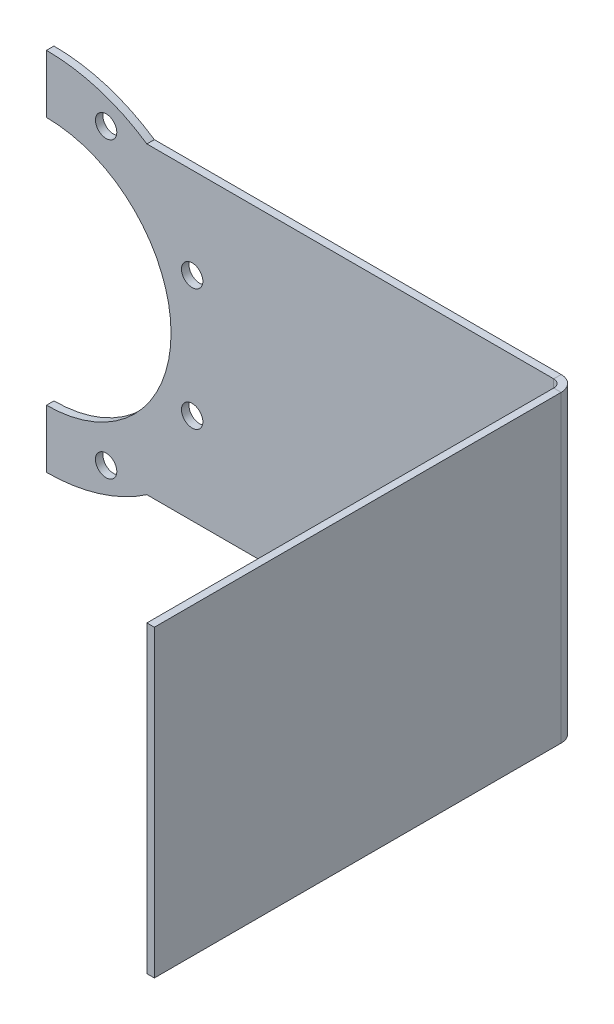
ISO-10303-21;
HEADER;
FILE_DESCRIPTION(('STEP AP214'),'2;1');
FILE_NAME('part.step','',(''),(''),'','','');
FILE_SCHEMA(('AUTOMOTIVE_DESIGN { 1 0 10303 214 1 1 1 1 }'));
ENDSEC;
DATA;
#1=APPLICATION_CONTEXT('core data for automotive mechanical design processes');
#2=APPLICATION_PROTOCOL_DEFINITION('international standard','automotive_design',2000,#1);
#3=PRODUCT_CONTEXT('',#1,'mechanical');
#4=PRODUCT('Part','Part','',(#3));
#5=PRODUCT_RELATED_PRODUCT_CATEGORY('part','',(#4));
#6=PRODUCT_DEFINITION_FORMATION('','',#4);
#7=PRODUCT_DEFINITION_CONTEXT('part definition',#1,'design');
#8=PRODUCT_DEFINITION('design','',#6,#7);
#9=PRODUCT_DEFINITION_SHAPE('','',#8);
#10=(LENGTH_UNIT() NAMED_UNIT(*) SI_UNIT(.MILLI.,.METRE.));
#11=(NAMED_UNIT(*) PLANE_ANGLE_UNIT() SI_UNIT($,.RADIAN.));
#12=(NAMED_UNIT(*) SI_UNIT($,.STERADIAN.) SOLID_ANGLE_UNIT());
#13=UNCERTAINTY_MEASURE_WITH_UNIT(LENGTH_MEASURE(1.E-05),#10,'distance_accuracy_value','');
#14=(GEOMETRIC_REPRESENTATION_CONTEXT(3) GLOBAL_UNCERTAINTY_ASSIGNED_CONTEXT((#13)) GLOBAL_UNIT_ASSIGNED_CONTEXT((#10,
#11,#12)) REPRESENTATION_CONTEXT('',''));
#15=CARTESIAN_POINT('',(0.,0.,0.));
#16=DIRECTION('',(0.,0.,1.));
#17=DIRECTION('',(1.,0.,0.));
#18=AXIS2_PLACEMENT_3D('',#15,#16,#17);
#19=CARTESIAN_POINT('',(108.791351850249,0.813693745948828,-108.811310834662));
#20=DIRECTION('',(1.,0.,0.));
#21=DIRECTION('',(0.,0.,-1.));
#22=AXIS2_PLACEMENT_3D('',#19,#20,#21);
#23=PLANE('',#22);
#24=DIRECTION('',(0.,0.,-1.));
#25=VECTOR('',#24,1.);
#26=CARTESIAN_POINT('',(108.791351850249,31.9980801149858,-87.6516665369411));
#27=LINE('',#26,#25);
#28=CARTESIAN_POINT('',(108.791351850249,31.9980801149857,87.3817075525276));
#29=VERTEX_POINT('',#28);
#30=CARTESIAN_POINT('',(108.791351850249,31.9980801149858,1.67640000000004));
#31=VERTEX_POINT('',#30);
#32=EDGE_CURVE('E64',#29,#31,#27,.T.);
#33=ORIENTED_EDGE('',*,*,#32,.T.);
#34=DIRECTION('',(0.,-1.,0.));
#35=VECTOR('',#34,1.);
#36=CARTESIAN_POINT('',(108.791351850249,0.813693745948828,1.67640000000002));
#37=LINE('',#36,#35);
#38=CARTESIAN_POINT('',(108.791351850249,-31.9980801149858,1.67640000000004));
#39=VERTEX_POINT('',#38);
#40=EDGE_CURVE('E56',#31,#39,#37,.T.);
#41=ORIENTED_EDGE('',*,*,#40,.T.);
#42=DIRECTION('',(0.,0.,1.));
#43=VECTOR('',#42,1.);
#44=CARTESIAN_POINT('',(108.791351850249,-31.9980801149858,87.3817075525276));
#45=LINE('',#44,#43);
#46=CARTESIAN_POINT('',(108.791351850249,-31.9980801149858,87.3817075525276));
#47=VERTEX_POINT('',#46);
#48=EDGE_CURVE('E72',#39,#47,#45,.T.);
#49=ORIENTED_EDGE('',*,*,#48,.T.);
#50=DIRECTION('',(0.,1.,0.));
#51=VECTOR('',#50,1.);
#52=CARTESIAN_POINT('',(108.791351850249,31.9980801149857,87.3817075525276));
#53=LINE('',#52,#51);
#54=EDGE_CURVE('E230',#47,#29,#53,.T.);
#55=ORIENTED_EDGE('',*,*,#54,.T.);
#56=EDGE_LOOP('',(#33,#41,#49,#55));
#57=FACE_BOUND('',#56,.T.);
#58=ADVANCED_FACE('F47',(#57),#23,.F.);
#59=CARTESIAN_POINT('',(110.366151850249,31.9980801149858,-87.6516665369411));
#60=DIRECTION('',(0.,1.,0.));
#61=DIRECTION('',(-1.,0.,0.));
#62=AXIS2_PLACEMENT_3D('',#59,#60,#61);
#63=PLANE('',#62);
#64=DIRECTION('',(1.,0.,0.));
#65=VECTOR('',#64,1.);
#66=CARTESIAN_POINT('',(110.366151850249,31.9980801149858,1.67640000000002));
#67=LINE('',#66,#65);
#68=CARTESIAN_POINT('',(110.366151850249,31.9980801149858,1.67640000000004));
#69=VERTEX_POINT('',#68);
#70=EDGE_CURVE('E12',#31,#69,#67,.T.);
#71=ORIENTED_EDGE('',*,*,#70,.F.);
#72=ORIENTED_EDGE('',*,*,#32,.F.);
#73=DIRECTION('',(-1.,0.,0.));
#74=VECTOR('',#73,1.);
#75=CARTESIAN_POINT('',(110.366151850249,31.9980801149857,87.3817075525276));
#76=LINE('',#75,#74);
#77=CARTESIAN_POINT('',(110.366151850249,31.9980801149857,87.3817075525276));
#78=VERTEX_POINT('',#77);
#79=EDGE_CURVE('E232',#78,#29,#76,.T.);
#80=ORIENTED_EDGE('',*,*,#79,.F.);
#81=DIRECTION('',(0.,0.,-1.));
#82=VECTOR('',#81,1.);
#83=CARTESIAN_POINT('',(110.366151850249,31.9980801149858,-6.1316308956318));
#84=LINE('',#83,#82);
#85=EDGE_CURVE('E229',#78,#69,#84,.T.);
#86=ORIENTED_EDGE('',*,*,#85,.T.);
#87=EDGE_LOOP('',(#71,#72,#80,#86));
#88=FACE_BOUND('',#87,.T.);
#89=ADVANCED_FACE('F49',(#88),#63,.T.);
#90=CARTESIAN_POINT('',(110.366151850249,31.9980801149857,87.3817075525276));
#91=DIRECTION('',(0.,0.,1.));
#92=DIRECTION('',(0.,1.,0.));
#93=AXIS2_PLACEMENT_3D('',#90,#91,#92);
#94=PLANE('',#93);
#95=ORIENTED_EDGE('',*,*,#54,.F.);
#96=DIRECTION('',(-1.,0.,0.));
#97=VECTOR('',#96,1.);
#98=CARTESIAN_POINT('',(110.366151850249,-31.9980801149858,87.3817075525276));
#99=LINE('',#98,#97);
#100=CARTESIAN_POINT('',(110.366151850249,-31.9980801149858,87.3817075525276));
#101=VERTEX_POINT('',#100);
#102=EDGE_CURVE('E235',#101,#47,#99,.T.);
#103=ORIENTED_EDGE('',*,*,#102,.F.);
#104=DIRECTION('',(0.,1.,0.));
#105=VECTOR('',#104,1.);
#106=CARTESIAN_POINT('',(110.366151850249,31.9980801149857,87.3817075525276));
#107=LINE('',#106,#105);
#108=EDGE_CURVE('E226',#101,#78,#107,.T.);
#109=ORIENTED_EDGE('',*,*,#108,.T.);
#110=ORIENTED_EDGE('',*,*,#79,.T.);
#111=EDGE_LOOP('',(#95,#103,#109,#110));
#112=FACE_BOUND('',#111,.T.);
#113=ADVANCED_FACE('F251',(#112),#94,.T.);
#114=CARTESIAN_POINT('',(110.366151850249,-31.9980801149858,87.3817075525276));
#115=DIRECTION('',(0.,-1.,0.));
#116=DIRECTION('',(1.,0.,0.));
#117=AXIS2_PLACEMENT_3D('',#114,#115,#116);
#118=PLANE('',#117);
#119=DIRECTION('',(-1.,0.,0.));
#120=VECTOR('',#119,1.);
#121=CARTESIAN_POINT('',(110.366151850249,-31.9980801149858,1.67640000000004));
#122=LINE('',#121,#120);
#123=CARTESIAN_POINT('',(110.366151850249,-31.9980801149858,1.67639999999997));
#124=VERTEX_POINT('',#123);
#125=EDGE_CURVE('E238',#124,#39,#122,.T.);
#126=ORIENTED_EDGE('',*,*,#125,.F.);
#127=DIRECTION('',(0.,0.,1.));
#128=VECTOR('',#127,1.);
#129=CARTESIAN_POINT('',(110.366151850249,-31.9980801149857,-6.13163089563183));
#130=LINE('',#129,#128);
#131=EDGE_CURVE('E51',#124,#101,#130,.T.);
#132=ORIENTED_EDGE('',*,*,#131,.T.);
#133=ORIENTED_EDGE('',*,*,#102,.T.);
#134=ORIENTED_EDGE('',*,*,#48,.F.);
#135=EDGE_LOOP('',(#126,#132,#133,#134));
#136=FACE_BOUND('',#135,.T.);
#137=ADVANCED_FACE('F246',(#136),#118,.T.);
#138=CARTESIAN_POINT('',(110.366151850249,0.813693745948828,-108.811310834662));
#139=DIRECTION('',(1.,0.,0.));
#140=DIRECTION('',(0.,0.,-1.));
#141=AXIS2_PLACEMENT_3D('',#138,#139,#140);
#142=PLANE('',#141);
#143=DIRECTION('',(0.,-1.,0.));
#144=VECTOR('',#143,1.);
#145=CARTESIAN_POINT('',(110.366151850249,0.813693745948828,1.67640000000002));
#146=LINE('',#145,#144);
#147=EDGE_CURVE('E158',#69,#124,#146,.T.);
#148=ORIENTED_EDGE('',*,*,#147,.F.);
#149=ORIENTED_EDGE('',*,*,#85,.F.);
#150=ORIENTED_EDGE('',*,*,#108,.F.);
#151=ORIENTED_EDGE('',*,*,#131,.F.);
#152=EDGE_LOOP('',(#148,#149,#150,#151));
#153=FACE_BOUND('',#152,.T.);
#154=ADVANCED_FACE('F253',(#153),#142,.T.);
#155=CARTESIAN_POINT('',(0.250000000000011,0.813693745948779,-1.5748));
#156=DIRECTION('',(0.,0.,1.));
#157=DIRECTION('',(1.,0.,0.));
#158=AXIS2_PLACEMENT_3D('',#155,#156,#157);
#159=CYLINDRICAL_SURFACE('',#158,37.685494557183);
#160=CARTESIAN_POINT('',(0.250000000000011,0.813693745948779,0.));
#161=DIRECTION('',(0.,0.,1.));
#162=DIRECTION('',(-1.,0.,0.));
#163=AXIS2_PLACEMENT_3D('',#160,#161,#162);
#164=CIRCLE('',#163,37.685494557183);
#165=CARTESIAN_POINT('',(21.4096442977214,31.9980801149858,0.));
#166=VERTEX_POINT('',#165);
#167=CARTESIAN_POINT('',(0.25,38.4991883031318,0.));
#168=VERTEX_POINT('',#167);
#169=EDGE_CURVE('E285',#166,#168,#164,.T.);
#170=ORIENTED_EDGE('',*,*,#169,.F.);
#171=DIRECTION('',(0.,0.,1.));
#172=VECTOR('',#171,1.);
#173=CARTESIAN_POINT('',(21.4096442977214,31.9980801149858,-1.5748));
#174=LINE('',#173,#172);
#175=CARTESIAN_POINT('',(21.4096442977214,31.9980801149858,-1.5748));
#176=VERTEX_POINT('',#175);
#177=EDGE_CURVE('E243',#176,#166,#174,.T.);
#178=ORIENTED_EDGE('',*,*,#177,.F.);
#179=CARTESIAN_POINT('',(0.250000000000011,0.813693745948779,-1.5748));
#180=DIRECTION('',(0.,0.,1.));
#181=DIRECTION('',(-1.,0.,0.));
#182=AXIS2_PLACEMENT_3D('',#179,#180,#181);
#183=CIRCLE('',#182,37.685494557183);
#184=CARTESIAN_POINT('',(0.25,38.4991883031318,-1.5748));
#185=VERTEX_POINT('',#184);
#186=EDGE_CURVE('E222',#176,#185,#183,.T.);
#187=ORIENTED_EDGE('',*,*,#186,.T.);
#188=DIRECTION('',(0.,0.,1.));
#189=VECTOR('',#188,1.);
#190=CARTESIAN_POINT('',(0.25,38.4991883031318,-1.5748));
#191=LINE('',#190,#189);
#192=EDGE_CURVE('E220',#185,#168,#191,.T.);
#193=ORIENTED_EDGE('',*,*,#192,.T.);
#194=EDGE_LOOP('',(#170,#178,#187,#193));
#195=FACE_BOUND('',#194,.T.);
#196=ADVANCED_FACE('F297',(#195),#159,.T.);
#197=CARTESIAN_POINT('',(0.25,38.4991883031318,-1.5748));
#198=DIRECTION('',(-1.,0.,0.));
#199=DIRECTION('',(0.,-1.,0.));
#200=AXIS2_PLACEMENT_3D('',#197,#198,#199);
#201=PLANE('',#200);
#202=DIRECTION('',(0.,-1.,0.));
#203=VECTOR('',#202,1.);
#204=CARTESIAN_POINT('',(0.25,38.4991883031318,0.));
#205=LINE('',#204,#203);
#206=CARTESIAN_POINT('',(0.250000000000009,26.2488094968134,0.));
#207=VERTEX_POINT('',#206);
#208=EDGE_CURVE('E282',#168,#207,#205,.T.);
#209=ORIENTED_EDGE('',*,*,#208,.F.);
#210=ORIENTED_EDGE('',*,*,#192,.F.);
#211=DIRECTION('',(0.,-1.,0.));
#212=VECTOR('',#211,1.);
#213=CARTESIAN_POINT('',(0.25,38.4991883031318,-1.5748));
#214=LINE('',#213,#212);
#215=CARTESIAN_POINT('',(0.250000000000009,26.2488094968134,-1.5748));
#216=VERTEX_POINT('',#215);
#217=EDGE_CURVE('E217',#185,#216,#214,.T.);
#218=ORIENTED_EDGE('',*,*,#217,.T.);
#219=DIRECTION('',(0.,0.,1.));
#220=VECTOR('',#219,1.);
#221=CARTESIAN_POINT('',(0.250000000000009,26.2488094968134,-1.5748));
#222=LINE('',#221,#220);
#223=EDGE_CURVE('E215',#216,#207,#222,.T.);
#224=ORIENTED_EDGE('',*,*,#223,.T.);
#225=EDGE_LOOP('',(#209,#210,#218,#224));
#226=FACE_BOUND('',#225,.T.);
#227=ADVANCED_FACE('F301',(#226),#201,.T.);
#228=CARTESIAN_POINT('',(0.250000000000007,0.,-1.5748));
#229=DIRECTION('',(0.,0.,1.));
#230=DIRECTION('',(1.,0.,0.));
#231=AXIS2_PLACEMENT_3D('',#228,#229,#230);
#232=CYLINDRICAL_SURFACE('',#231,26.2488094968134);
#233=CARTESIAN_POINT('',(0.250000000000007,0.,0.));
#234=DIRECTION('',(0.,0.,-1.));
#235=DIRECTION('',(1.,0.,0.));
#236=AXIS2_PLACEMENT_3D('',#233,#234,#235);
#237=CIRCLE('',#236,26.2488094968134);
#238=CARTESIAN_POINT('',(0.250000000000011,-26.2488094968134,0.));
#239=VERTEX_POINT('',#238);
#240=EDGE_CURVE('E279',#207,#239,#237,.T.);
#241=ORIENTED_EDGE('',*,*,#240,.F.);
#242=ORIENTED_EDGE('',*,*,#223,.F.);
#243=CARTESIAN_POINT('',(0.250000000000007,0.,-1.5748));
#244=DIRECTION('',(0.,0.,-1.));
#245=DIRECTION('',(1.,0.,0.));
#246=AXIS2_PLACEMENT_3D('',#243,#244,#245);
#247=CIRCLE('',#246,26.2488094968134);
#248=CARTESIAN_POINT('',(0.250000000000011,-26.2488094968134,-1.5748));
#249=VERTEX_POINT('',#248);
#250=EDGE_CURVE('E212',#216,#249,#247,.T.);
#251=ORIENTED_EDGE('',*,*,#250,.T.);
#252=DIRECTION('',(0.,0.,1.));
#253=VECTOR('',#252,1.);
#254=CARTESIAN_POINT('',(0.250000000000011,-26.2488094968134,-1.5748));
#255=LINE('',#254,#253);
#256=EDGE_CURVE('E210',#249,#239,#255,.T.);
#257=ORIENTED_EDGE('',*,*,#256,.T.);
#258=EDGE_LOOP('',(#241,#242,#251,#257));
#259=FACE_BOUND('',#258,.T.);
#260=ADVANCED_FACE('F305',(#259),#232,.F.);
#261=CARTESIAN_POINT('',(0.250000000000011,-38.4991883031318,-1.5748));
#262=DIRECTION('',(-1.,0.,0.));
#263=DIRECTION('',(0.,0.,1.));
#264=AXIS2_PLACEMENT_3D('',#261,#262,#263);
#265=PLANE('',#264);
#266=DIRECTION('',(0.,-1.,0.));
#267=VECTOR('',#266,1.);
#268=CARTESIAN_POINT('',(0.250000000000011,-38.4991883031318,0.));
#269=LINE('',#268,#267);
#270=CARTESIAN_POINT('',(0.250000000000004,-38.4991883031318,0.));
#271=VERTEX_POINT('',#270);
#272=EDGE_CURVE('E276',#239,#271,#269,.T.);
#273=ORIENTED_EDGE('',*,*,#272,.F.);
#274=ORIENTED_EDGE('',*,*,#256,.F.);
#275=DIRECTION('',(0.,-1.,0.));
#276=VECTOR('',#275,1.);
#277=CARTESIAN_POINT('',(0.250000000000011,-38.4991883031318,-1.5748));
#278=LINE('',#277,#276);
#279=CARTESIAN_POINT('',(0.250000000000004,-38.4991883031318,-1.5748));
#280=VERTEX_POINT('',#279);
#281=EDGE_CURVE('E207',#249,#280,#278,.T.);
#282=ORIENTED_EDGE('',*,*,#281,.T.);
#283=DIRECTION('',(0.,0.,1.));
#284=VECTOR('',#283,1.);
#285=CARTESIAN_POINT('',(0.250000000000004,-38.4991883031318,-1.5748));
#286=LINE('',#285,#284);
#287=EDGE_CURVE('E205',#280,#271,#286,.T.);
#288=ORIENTED_EDGE('',*,*,#287,.T.);
#289=EDGE_LOOP('',(#273,#274,#282,#288));
#290=FACE_BOUND('',#289,.T.);
#291=ADVANCED_FACE('F309',(#290),#265,.T.);
#292=CARTESIAN_POINT('',(0.250000000000011,-0.813693745948682,-1.5748));
#293=DIRECTION('',(0.,0.,1.));
#294=DIRECTION('',(1.,0.,0.));
#295=AXIS2_PLACEMENT_3D('',#292,#293,#294);
#296=CYLINDRICAL_SURFACE('',#295,37.6854945571831);
#297=CARTESIAN_POINT('',(0.250000000000011,-0.813693745948682,0.));
#298=DIRECTION('',(0.,0.,1.));
#299=DIRECTION('',(1.,0.,0.));
#300=AXIS2_PLACEMENT_3D('',#297,#298,#299);
#301=CIRCLE('',#300,37.6854945571831);
#302=CARTESIAN_POINT('',(21.4096442977214,-31.9980801149857,0.));
#303=VERTEX_POINT('',#302);
#304=EDGE_CURVE('E273',#271,#303,#301,.T.);
#305=ORIENTED_EDGE('',*,*,#304,.F.);
#306=ORIENTED_EDGE('',*,*,#287,.F.);
#307=CARTESIAN_POINT('',(0.250000000000011,-0.813693745948682,-1.5748));
#308=DIRECTION('',(0.,0.,1.));
#309=DIRECTION('',(1.,0.,0.));
#310=AXIS2_PLACEMENT_3D('',#307,#308,#309);
#311=CIRCLE('',#310,37.6854945571831);
#312=CARTESIAN_POINT('',(21.4096442977214,-31.9980801149857,-1.5748));
#313=VERTEX_POINT('',#312);
#314=EDGE_CURVE('E203',#280,#313,#311,.T.);
#315=ORIENTED_EDGE('',*,*,#314,.T.);
#316=DIRECTION('',(0.,0.,1.));
#317=VECTOR('',#316,1.);
#318=CARTESIAN_POINT('',(21.4096442977214,-31.9980801149857,-1.5748));
#319=LINE('',#318,#317);
#320=EDGE_CURVE('E175',#313,#303,#319,.T.);
#321=ORIENTED_EDGE('',*,*,#320,.T.);
#322=EDGE_LOOP('',(#305,#306,#315,#321));
#323=FACE_BOUND('',#322,.T.);
#324=ADVANCED_FACE('F312',(#323),#296,.T.);
#325=CARTESIAN_POINT('',(12.8198949842303,30.9499643391282,-1.5748));
#326=DIRECTION('',(0.,0.,1.));
#327=DIRECTION('',(1.,0.,0.));
#328=AXIS2_PLACEMENT_3D('',#325,#326,#327);
#329=CYLINDRICAL_SURFACE('',#328,2.25);
#330=CARTESIAN_POINT('',(12.8198949842303,30.9499643391282,-1.5748));
#331=DIRECTION('',(0.,0.,1.));
#332=DIRECTION('',(1.,0.,0.));
#333=AXIS2_PLACEMENT_3D('',#330,#331,#332);
#334=CIRCLE('',#333,2.25);
#335=CARTESIAN_POINT('',(15.0698949842303,30.9499643391282,-1.5748));
#336=VERTEX_POINT('',#335);
#337=EDGE_CURVE('E171',#336,#336,#334,.T.);
#338=ORIENTED_EDGE('',*,*,#337,.F.);
#339=EDGE_LOOP('',(#338));
#340=FACE_BOUND('',#339,.T.);
#341=CARTESIAN_POINT('',(12.8198949842303,30.9499643391282,0.));
#342=DIRECTION('',(0.,0.,1.));
#343=DIRECTION('',(1.,0.,0.));
#344=AXIS2_PLACEMENT_3D('',#341,#342,#343);
#345=CIRCLE('',#344,2.25);
#346=CARTESIAN_POINT('',(15.0698949842303,30.9499643391282,0.));
#347=VERTEX_POINT('',#346);
#348=EDGE_CURVE('E199',#347,#347,#345,.T.);
#349=ORIENTED_EDGE('',*,*,#348,.T.);
#350=EDGE_LOOP('',(#349));
#351=FACE_BOUND('',#350,.T.);
#352=ADVANCED_FACE('F314',(#340,#351),#329,.F.);
#353=CARTESIAN_POINT('',(30.949964339128,12.8198949842307,-1.5748));
#354=DIRECTION('',(0.,0.,1.));
#355=DIRECTION('',(1.,0.,0.));
#356=AXIS2_PLACEMENT_3D('',#353,#354,#355);
#357=CYLINDRICAL_SURFACE('',#356,2.25);
#358=CARTESIAN_POINT('',(30.949964339128,12.8198949842307,-1.5748));
#359=DIRECTION('',(0.,0.,1.));
#360=DIRECTION('',(1.,0.,0.));
#361=AXIS2_PLACEMENT_3D('',#358,#359,#360);
#362=CIRCLE('',#361,2.25);
#363=CARTESIAN_POINT('',(33.199964339128,12.8198949842307,-1.5748));
#364=VERTEX_POINT('',#363);
#365=EDGE_CURVE('E181',#364,#364,#362,.T.);
#366=ORIENTED_EDGE('',*,*,#365,.F.);
#367=EDGE_LOOP('',(#366));
#368=FACE_BOUND('',#367,.T.);
#369=CARTESIAN_POINT('',(30.949964339128,12.8198949842307,0.));
#370=DIRECTION('',(0.,0.,1.));
#371=DIRECTION('',(1.,0.,0.));
#372=AXIS2_PLACEMENT_3D('',#369,#370,#371);
#373=CIRCLE('',#372,2.25);
#374=CARTESIAN_POINT('',(33.199964339128,12.8198949842307,0.));
#375=VERTEX_POINT('',#374);
#376=EDGE_CURVE('E196',#375,#375,#373,.T.);
#377=ORIENTED_EDGE('',*,*,#376,.T.);
#378=EDGE_LOOP('',(#377));
#379=FACE_BOUND('',#378,.T.);
#380=ADVANCED_FACE('F320',(#368,#379),#357,.F.);
#381=CARTESIAN_POINT('',(30.9499643391282,-12.8198949842303,-1.5748));
#382=DIRECTION('',(0.,0.,1.));
#383=DIRECTION('',(1.,0.,0.));
#384=AXIS2_PLACEMENT_3D('',#381,#382,#383);
#385=CYLINDRICAL_SURFACE('',#384,2.25000000000001);
#386=CARTESIAN_POINT('',(30.9499643391282,-12.8198949842303,-1.5748));
#387=DIRECTION('',(0.,0.,1.));
#388=DIRECTION('',(1.,0.,0.));
#389=AXIS2_PLACEMENT_3D('',#386,#387,#388);
#390=CIRCLE('',#389,2.25000000000001);
#391=CARTESIAN_POINT('',(33.1999643391282,-12.8198949842303,-1.5748));
#392=VERTEX_POINT('',#391);
#393=EDGE_CURVE('E184',#392,#392,#390,.T.);
#394=ORIENTED_EDGE('',*,*,#393,.F.);
#395=EDGE_LOOP('',(#394));
#396=FACE_BOUND('',#395,.T.);
#397=CARTESIAN_POINT('',(30.9499643391282,-12.8198949842303,0.));
#398=DIRECTION('',(0.,0.,1.));
#399=DIRECTION('',(1.,0.,0.));
#400=AXIS2_PLACEMENT_3D('',#397,#398,#399);
#401=CIRCLE('',#400,2.25000000000001);
#402=CARTESIAN_POINT('',(33.1999643391282,-12.8198949842303,0.));
#403=VERTEX_POINT('',#402);
#404=EDGE_CURVE('E193',#403,#403,#401,.T.);
#405=ORIENTED_EDGE('',*,*,#404,.T.);
#406=EDGE_LOOP('',(#405));
#407=FACE_BOUND('',#406,.T.);
#408=ADVANCED_FACE('F347',(#396,#407),#385,.F.);
#409=CARTESIAN_POINT('',(12.8198949842307,-30.949964339128,-1.5748));
#410=DIRECTION('',(0.,0.,1.));
#411=DIRECTION('',(1.,0.,0.));
#412=AXIS2_PLACEMENT_3D('',#409,#410,#411);
#413=CYLINDRICAL_SURFACE('',#412,2.24999999999999);
#414=CARTESIAN_POINT('',(12.8198949842307,-30.949964339128,-1.5748));
#415=DIRECTION('',(0.,0.,1.));
#416=DIRECTION('',(1.,0.,0.));
#417=AXIS2_PLACEMENT_3D('',#414,#415,#416);
#418=CIRCLE('',#417,2.24999999999999);
#419=CARTESIAN_POINT('',(15.0698949842307,-30.949964339128,-1.5748));
#420=VERTEX_POINT('',#419);
#421=EDGE_CURVE('E187',#420,#420,#418,.T.);
#422=ORIENTED_EDGE('',*,*,#421,.F.);
#423=EDGE_LOOP('',(#422));
#424=FACE_BOUND('',#423,.T.);
#425=CARTESIAN_POINT('',(12.8198949842307,-30.949964339128,0.));
#426=DIRECTION('',(0.,0.,1.));
#427=DIRECTION('',(1.,0.,0.));
#428=AXIS2_PLACEMENT_3D('',#425,#426,#427);
#429=CIRCLE('',#428,2.24999999999999);
#430=CARTESIAN_POINT('',(15.0698949842307,-30.949964339128,0.));
#431=VERTEX_POINT('',#430);
#432=EDGE_CURVE('E190',#431,#431,#429,.T.);
#433=ORIENTED_EDGE('',*,*,#432,.T.);
#434=EDGE_LOOP('',(#433));
#435=FACE_BOUND('',#434,.T.);
#436=ADVANCED_FACE('F343',(#424,#435),#413,.F.);
#437=CARTESIAN_POINT('',(0.250000000000011,0.813693745948779,-1.5748));
#438=DIRECTION('',(0.,0.,-1.));
#439=DIRECTION('',(-1.,0.,0.));
#440=AXIS2_PLACEMENT_3D('',#437,#438,#439);
#441=PLANE('',#440);
#442=ORIENTED_EDGE('',*,*,#421,.T.);
#443=EDGE_LOOP('',(#442));
#444=FACE_BOUND('',#443,.T.);
#445=ORIENTED_EDGE('',*,*,#393,.T.);
#446=EDGE_LOOP('',(#445));
#447=FACE_BOUND('',#446,.T.);
#448=ORIENTED_EDGE('',*,*,#365,.T.);
#449=EDGE_LOOP('',(#448));
#450=FACE_BOUND('',#449,.T.);
#451=ORIENTED_EDGE('',*,*,#337,.T.);
#452=EDGE_LOOP('',(#451));
#453=FACE_BOUND('',#452,.T.);
#454=DIRECTION('',(-1.,0.,0.));
#455=VECTOR('',#454,1.);
#456=CARTESIAN_POINT('',(102.929679939031,31.9980801149858,-1.5748));
#457=LINE('',#456,#455);
#458=CARTESIAN_POINT('',(107.114951850249,31.9980801149858,-1.5748));
#459=VERTEX_POINT('',#458);
#460=EDGE_CURVE('E169',#459,#176,#457,.T.);
#461=ORIENTED_EDGE('',*,*,#460,.F.);
#462=DIRECTION('',(0.,-1.,0.));
#463=VECTOR('',#462,1.);
#464=CARTESIAN_POINT('',(107.114951850249,0.813693745948825,-1.5748));
#465=LINE('',#464,#463);
#466=CARTESIAN_POINT('',(107.114951850249,-31.9980801149858,-1.5748));
#467=VERTEX_POINT('',#466);
#468=EDGE_CURVE('E156',#459,#467,#465,.T.);
#469=ORIENTED_EDGE('',*,*,#468,.T.);
#470=DIRECTION('',(1.,0.,0.));
#471=VECTOR('',#470,1.);
#472=CARTESIAN_POINT('',(102.929679939031,-31.9980801149858,-1.5748));
#473=LINE('',#472,#471);
#474=EDGE_CURVE('E149',#313,#467,#473,.T.);
#475=ORIENTED_EDGE('',*,*,#474,.F.);
#476=ORIENTED_EDGE('',*,*,#314,.F.);
#477=ORIENTED_EDGE('',*,*,#281,.F.);
#478=ORIENTED_EDGE('',*,*,#250,.F.);
#479=ORIENTED_EDGE('',*,*,#217,.F.);
#480=ORIENTED_EDGE('',*,*,#186,.F.);
#481=EDGE_LOOP('',(#461,#469,#475,#476,#477,#478,#479,#480));
#482=FACE_BOUND('',#481,.T.);
#483=ADVANCED_FACE('F165',(#444,#447,#450,#453,#482),#441,.T.);
#484=CARTESIAN_POINT('',(196.44301838719,-31.9980801149858,-1.5748));
#485=DIRECTION('',(0.,-1.,0.));
#486=DIRECTION('',(0.,0.,-1.));
#487=AXIS2_PLACEMENT_3D('',#484,#485,#486);
#488=PLANE('',#487);
#489=ORIENTED_EDGE('',*,*,#474,.T.);
#490=DIRECTION('',(0.,0.,1.));
#491=VECTOR('',#490,1.);
#492=CARTESIAN_POINT('',(107.114951850249,-31.9980801149858,-1.5748));
#493=LINE('',#492,#491);
#494=CARTESIAN_POINT('',(107.114951850249,-31.9980801149858,0.));
#495=VERTEX_POINT('',#494);
#496=EDGE_CURVE('E138',#467,#495,#493,.T.);
#497=ORIENTED_EDGE('',*,*,#496,.T.);
#498=DIRECTION('',(1.,0.,0.));
#499=VECTOR('',#498,1.);
#500=CARTESIAN_POINT('',(196.44301838719,-31.9980801149858,0.));
#501=LINE('',#500,#499);
#502=EDGE_CURVE('E270',#303,#495,#501,.T.);
#503=ORIENTED_EDGE('',*,*,#502,.F.);
#504=ORIENTED_EDGE('',*,*,#320,.F.);
#505=EDGE_LOOP('',(#489,#497,#503,#504));
#506=FACE_BOUND('',#505,.T.);
#507=ADVANCED_FACE('F173',(#506),#488,.T.);
#508=CARTESIAN_POINT('',(0.250000000000011,0.813693745948779,0.));
#509=DIRECTION('',(0.,0.,-1.));
#510=DIRECTION('',(-1.,0.,0.));
#511=AXIS2_PLACEMENT_3D('',#508,#509,#510);
#512=PLANE('',#511);
#513=DIRECTION('',(0.,-1.,0.));
#514=VECTOR('',#513,1.);
#515=CARTESIAN_POINT('',(107.114951850249,0.813693745948825,0.));
#516=LINE('',#515,#514);
#517=CARTESIAN_POINT('',(107.114951850249,31.9980801149858,0.));
#518=VERTEX_POINT('',#517);
#519=EDGE_CURVE('E159',#518,#495,#516,.T.);
#520=ORIENTED_EDGE('',*,*,#519,.F.);
#521=DIRECTION('',(-1.,0.,0.));
#522=VECTOR('',#521,1.);
#523=CARTESIAN_POINT('',(21.4096442977214,31.9980801149858,0.));
#524=LINE('',#523,#522);
#525=EDGE_CURVE('E148',#518,#166,#524,.T.);
#526=ORIENTED_EDGE('',*,*,#525,.T.);
#527=ORIENTED_EDGE('',*,*,#169,.T.);
#528=ORIENTED_EDGE('',*,*,#208,.T.);
#529=ORIENTED_EDGE('',*,*,#240,.T.);
#530=ORIENTED_EDGE('',*,*,#272,.T.);
#531=ORIENTED_EDGE('',*,*,#304,.T.);
#532=ORIENTED_EDGE('',*,*,#502,.T.);
#533=EDGE_LOOP('',(#520,#526,#527,#528,#529,#530,#531,#532));
#534=FACE_BOUND('',#533,.T.);
#535=ORIENTED_EDGE('',*,*,#432,.F.);
#536=EDGE_LOOP('',(#535));
#537=FACE_BOUND('',#536,.T.);
#538=ORIENTED_EDGE('',*,*,#404,.F.);
#539=EDGE_LOOP('',(#538));
#540=FACE_BOUND('',#539,.T.);
#541=ORIENTED_EDGE('',*,*,#376,.F.);
#542=EDGE_LOOP('',(#541));
#543=FACE_BOUND('',#542,.T.);
#544=ORIENTED_EDGE('',*,*,#348,.F.);
#545=EDGE_LOOP('',(#544));
#546=FACE_BOUND('',#545,.T.);
#547=ADVANCED_FACE('F290',(#534,#537,#540,#543,#546),#512,.F.);
#548=CARTESIAN_POINT('',(21.4096442977214,31.9980801149858,-1.5748));
#549=DIRECTION('',(0.,1.,0.));
#550=DIRECTION('',(0.,0.,1.));
#551=AXIS2_PLACEMENT_3D('',#548,#549,#550);
#552=PLANE('',#551);
#553=ORIENTED_EDGE('',*,*,#525,.F.);
#554=DIRECTION('',(0.,0.,-1.));
#555=VECTOR('',#554,1.);
#556=CARTESIAN_POINT('',(107.114951850249,31.9980801149858,-1.5748));
#557=LINE('',#556,#555);
#558=EDGE_CURVE('E268',#518,#459,#557,.T.);
#559=ORIENTED_EDGE('',*,*,#558,.T.);
#560=ORIENTED_EDGE('',*,*,#460,.T.);
#561=ORIENTED_EDGE('',*,*,#177,.T.);
#562=EDGE_LOOP('',(#553,#559,#560,#561));
#563=FACE_BOUND('',#562,.T.);
#564=ADVANCED_FACE('F295',(#563),#552,.T.);
#565=CARTESIAN_POINT('',(107.114951850249,31.9980801149858,1.6764));
#566=DIRECTION('',(0.,1.,0.));
#567=DIRECTION('',(0.,0.,1.));
#568=AXIS2_PLACEMENT_3D('',#565,#566,#567);
#569=PLANE('',#568);
#570=ORIENTED_EDGE('',*,*,#558,.F.);
#571=CARTESIAN_POINT('',(107.114951850249,31.9980801149858,1.6764));
#572=DIRECTION('',(0.,-1.,0.));
#573=DIRECTION('',(1.,0.,0.));
#574=AXIS2_PLACEMENT_3D('',#571,#572,#573);
#575=CIRCLE('',#574,1.6764);
#576=EDGE_CURVE('E260',#518,#31,#575,.T.);
#577=ORIENTED_EDGE('',*,*,#576,.T.);
#578=ORIENTED_EDGE('',*,*,#70,.T.);
#579=CARTESIAN_POINT('',(107.114951850249,31.9980801149858,1.6764));
#580=DIRECTION('',(0.,-1.,0.));
#581=DIRECTION('',(0.,0.,1.));
#582=AXIS2_PLACEMENT_3D('',#579,#580,#581);
#583=CIRCLE('',#582,3.2512);
#584=EDGE_CURVE('E160',#459,#69,#583,.T.);
#585=ORIENTED_EDGE('',*,*,#584,.F.);
#586=EDGE_LOOP('',(#570,#577,#578,#585));
#587=FACE_BOUND('',#586,.T.);
#588=ADVANCED_FACE('F258',(#587),#569,.T.);
#589=CARTESIAN_POINT('',(107.114951850249,-31.9980801149858,1.6764));
#590=DIRECTION('',(0.,-1.,0.));
#591=DIRECTION('',(0.,0.,-1.));
#592=AXIS2_PLACEMENT_3D('',#589,#590,#591);
#593=PLANE('',#592);
#594=CARTESIAN_POINT('',(107.114951850249,-31.9980801149858,1.6764));
#595=DIRECTION('',(0.,-1.,0.));
#596=DIRECTION('',(1.,0.,0.));
#597=AXIS2_PLACEMENT_3D('',#594,#595,#596);
#598=CIRCLE('',#597,1.6764);
#599=EDGE_CURVE('E144',#39,#495,#598,.F.);
#600=ORIENTED_EDGE('',*,*,#599,.T.);
#601=ORIENTED_EDGE('',*,*,#496,.F.);
#602=CARTESIAN_POINT('',(107.114951850249,-31.9980801149858,1.6764));
#603=DIRECTION('',(0.,1.,0.));
#604=DIRECTION('',(0.,0.,-1.));
#605=AXIS2_PLACEMENT_3D('',#602,#603,#604);
#606=CIRCLE('',#605,3.2512);
#607=EDGE_CURVE('E142',#124,#467,#606,.T.);
#608=ORIENTED_EDGE('',*,*,#607,.F.);
#609=ORIENTED_EDGE('',*,*,#125,.T.);
#610=EDGE_LOOP('',(#600,#601,#608,#609));
#611=FACE_BOUND('',#610,.T.);
#612=ADVANCED_FACE('F140',(#611),#593,.T.);
#613=CARTESIAN_POINT('',(107.114951850249,64.1179608368773,1.6764));
#614=DIRECTION('',(0.,-1.,0.));
#615=DIRECTION('',(1.,0.,0.));
#616=AXIS2_PLACEMENT_3D('',#613,#614,#615);
#617=CYLINDRICAL_SURFACE('',#616,3.2512);
#618=ORIENTED_EDGE('',*,*,#147,.T.);
#619=ORIENTED_EDGE('',*,*,#607,.T.);
#620=ORIENTED_EDGE('',*,*,#468,.F.);
#621=ORIENTED_EDGE('',*,*,#584,.T.);
#622=EDGE_LOOP('',(#618,#619,#620,#621));
#623=FACE_BOUND('',#622,.T.);
#624=ADVANCED_FACE('F154',(#623),#617,.T.);
#625=CARTESIAN_POINT('',(107.114951850249,64.1179608368773,1.6764));
#626=DIRECTION('',(0.,-1.,0.));
#627=DIRECTION('',(1.,0.,0.));
#628=AXIS2_PLACEMENT_3D('',#625,#626,#627);
#629=CYLINDRICAL_SURFACE('',#628,1.6764);
#630=ORIENTED_EDGE('',*,*,#40,.F.);
#631=ORIENTED_EDGE('',*,*,#576,.F.);
#632=ORIENTED_EDGE('',*,*,#519,.T.);
#633=ORIENTED_EDGE('',*,*,#599,.F.);
#634=EDGE_LOOP('',(#630,#631,#632,#633));
#635=FACE_BOUND('',#634,.T.);
#636=ADVANCED_FACE('F410',(#635),#629,.F.);
#637=CLOSED_SHELL('',(#58,#89,#113,#137,#154,#196,#227,#260,#291,#324,#352,#380,#408,#436,#483,
#507,#547,#564,#588,#612,#624,#636));
#638=MANIFOLD_SOLID_BREP('B2',#637);
#639=ADVANCED_BREP_SHAPE_REPRESENTATION('',(#18,#638),#14);
#640=SHAPE_DEFINITION_REPRESENTATION(#9,#639);
ENDSEC;
END-ISO-10303-21;
